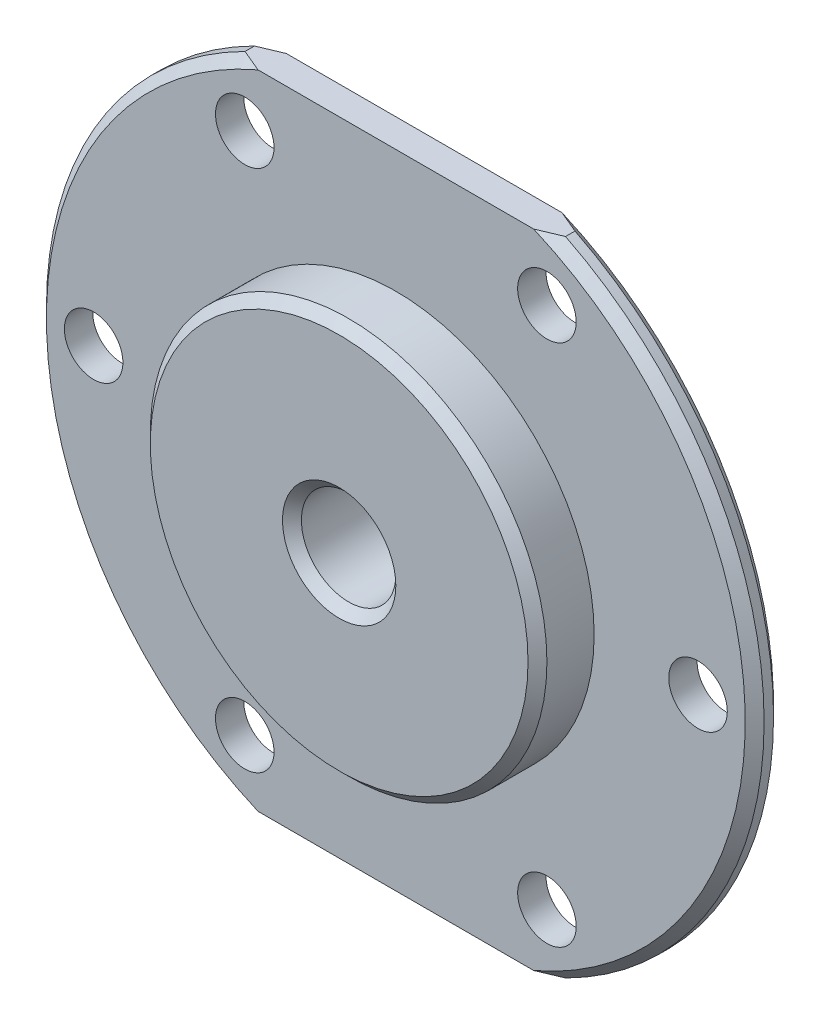
ISO-10303-21;
HEADER;
FILE_DESCRIPTION(('STEP AP214'),'2;1');
FILE_NAME('part.step','',(''),(''),'','','');
FILE_SCHEMA(('AUTOMOTIVE_DESIGN { 1 0 10303 214 1 1 1 1 }'));
ENDSEC;
DATA;
#1=APPLICATION_CONTEXT('core data for automotive mechanical design processes');
#2=APPLICATION_PROTOCOL_DEFINITION('international standard','automotive_design',2000,#1);
#3=PRODUCT_CONTEXT('',#1,'mechanical');
#4=PRODUCT('Part','Part','',(#3));
#5=PRODUCT_RELATED_PRODUCT_CATEGORY('part','',(#4));
#6=PRODUCT_DEFINITION_FORMATION('','',#4);
#7=PRODUCT_DEFINITION_CONTEXT('part definition',#1,'design');
#8=PRODUCT_DEFINITION('design','',#6,#7);
#9=PRODUCT_DEFINITION_SHAPE('','',#8);
#10=(LENGTH_UNIT() NAMED_UNIT(*) SI_UNIT(.MILLI.,.METRE.));
#11=(NAMED_UNIT(*) PLANE_ANGLE_UNIT() SI_UNIT($,.RADIAN.));
#12=(NAMED_UNIT(*) SI_UNIT($,.STERADIAN.) SOLID_ANGLE_UNIT());
#13=UNCERTAINTY_MEASURE_WITH_UNIT(LENGTH_MEASURE(1.E-05),#10,'distance_accuracy_value','');
#14=(GEOMETRIC_REPRESENTATION_CONTEXT(3) GLOBAL_UNCERTAINTY_ASSIGNED_CONTEXT((#13)) GLOBAL_UNIT_ASSIGNED_CONTEXT((#10,
#11,#12)) REPRESENTATION_CONTEXT('',''));
#15=CARTESIAN_POINT('',(0.,0.,0.));
#16=DIRECTION('',(0.,0.,1.));
#17=DIRECTION('',(1.,0.,0.));
#18=AXIS2_PLACEMENT_3D('',#15,#16,#17);
#19=CARTESIAN_POINT('',(0.,0.,1.5));
#20=DIRECTION('',(0.,0.,1.));
#21=DIRECTION('',(1.,0.,0.));
#22=AXIS2_PLACEMENT_3D('',#19,#20,#21);
#23=PLANE('',#22);
#24=CARTESIAN_POINT('',(0.,0.,1.5));
#25=DIRECTION('',(0.,0.,1.));
#26=DIRECTION('',(1.,0.,0.));
#27=AXIS2_PLACEMENT_3D('',#24,#25,#26);
#28=CIRCLE('',#27,10.5);
#29=CARTESIAN_POINT('',(10.5,0.,1.5));
#30=VERTEX_POINT('',#29);
#31=EDGE_CURVE('E349',#30,#30,#28,.T.);
#32=ORIENTED_EDGE('',*,*,#31,.F.);
#33=EDGE_LOOP('',(#32));
#34=FACE_BOUND('',#33,.T.);
#35=CARTESIAN_POINT('',(7.99999999999987,-13.8564064605511,1.5));
#36=DIRECTION('',(0.,0.,1.));
#37=DIRECTION('',(1.,0.,0.));
#38=AXIS2_PLACEMENT_3D('',#35,#36,#37);
#39=CIRCLE('',#38,1.55);
#40=CARTESIAN_POINT('',(9.54999999999987,-13.8564064605511,1.5));
#41=VERTEX_POINT('',#40);
#42=EDGE_CURVE('E359',#41,#41,#39,.T.);
#43=ORIENTED_EDGE('',*,*,#42,.F.);
#44=EDGE_LOOP('',(#43));
#45=FACE_BOUND('',#44,.T.);
#46=CARTESIAN_POINT('',(8.00000000000007,13.856406460551,1.5));
#47=DIRECTION('',(0.,0.,1.));
#48=DIRECTION('',(1.,0.,0.));
#49=AXIS2_PLACEMENT_3D('',#46,#47,#48);
#50=CIRCLE('',#49,1.55);
#51=CARTESIAN_POINT('',(9.55000000000006,13.856406460551,1.5));
#52=VERTEX_POINT('',#51);
#53=EDGE_CURVE('E371',#52,#52,#50,.T.);
#54=ORIENTED_EDGE('',*,*,#53,.F.);
#55=EDGE_LOOP('',(#54));
#56=FACE_BOUND('',#55,.T.);
#57=CARTESIAN_POINT('',(-16.,0.,1.5));
#58=DIRECTION('',(0.,0.,1.));
#59=DIRECTION('',(1.,0.,0.));
#60=AXIS2_PLACEMENT_3D('',#57,#58,#59);
#61=CIRCLE('',#60,1.55);
#62=CARTESIAN_POINT('',(-14.45,0.,1.5));
#63=VERTEX_POINT('',#62);
#64=EDGE_CURVE('E138',#63,#63,#61,.T.);
#65=ORIENTED_EDGE('',*,*,#64,.F.);
#66=EDGE_LOOP('',(#65));
#67=FACE_BOUND('',#66,.T.);
#68=DIRECTION('',(-1.,0.,0.));
#69=VECTOR('',#68,1.);
#70=CARTESIAN_POINT('',(-8.48528137423857,17.,1.5));
#71=LINE('',#70,#69);
#72=CARTESIAN_POINT('',(7.2972597596632,17.,1.5));
#73=VERTEX_POINT('',#72);
#74=CARTESIAN_POINT('',(-7.2972597596632,17.,1.5));
#75=VERTEX_POINT('',#74);
#76=EDGE_CURVE('E115',#73,#75,#71,.T.);
#77=ORIENTED_EDGE('',*,*,#76,.T.);
#78=CARTESIAN_POINT('',(0.,0.,1.5));
#79=DIRECTION('',(0.,0.,1.));
#80=DIRECTION('',(1.,0.,0.));
#81=AXIS2_PLACEMENT_3D('',#78,#79,#80);
#82=CIRCLE('',#81,18.5);
#83=CARTESIAN_POINT('',(-7.2972597596632,-17.,1.5));
#84=VERTEX_POINT('',#83);
#85=EDGE_CURVE('E119',#75,#84,#82,.T.);
#86=ORIENTED_EDGE('',*,*,#85,.T.);
#87=DIRECTION('',(1.,0.,0.));
#88=VECTOR('',#87,1.);
#89=CARTESIAN_POINT('',(-8.48528137423857,-17.,1.5));
#90=LINE('',#89,#88);
#91=CARTESIAN_POINT('',(7.2972597596632,-17.,1.5));
#92=VERTEX_POINT('',#91);
#93=EDGE_CURVE('E118',#84,#92,#90,.T.);
#94=ORIENTED_EDGE('',*,*,#93,.T.);
#95=CARTESIAN_POINT('',(0.,0.,1.5));
#96=DIRECTION('',(0.,0.,1.));
#97=DIRECTION('',(1.,0.,0.));
#98=AXIS2_PLACEMENT_3D('',#95,#96,#97);
#99=CIRCLE('',#98,18.5);
#100=EDGE_CURVE('E106',#92,#73,#99,.T.);
#101=ORIENTED_EDGE('',*,*,#100,.T.);
#102=EDGE_LOOP('',(#77,#86,#94,#101));
#103=FACE_BOUND('',#102,.T.);
#104=CARTESIAN_POINT('',(-7.99999999999997,13.856406460551,1.5));
#105=DIRECTION('',(0.,0.,1.));
#106=DIRECTION('',(1.,0.,0.));
#107=AXIS2_PLACEMENT_3D('',#104,#105,#106);
#108=CIRCLE('',#107,1.55);
#109=CARTESIAN_POINT('',(-6.44999999999997,13.856406460551,1.5));
#110=VERTEX_POINT('',#109);
#111=EDGE_CURVE('E377',#110,#110,#108,.T.);
#112=ORIENTED_EDGE('',*,*,#111,.F.);
#113=EDGE_LOOP('',(#112));
#114=FACE_BOUND('',#113,.T.);
#115=CARTESIAN_POINT('',(16.,-1.1172740284298E-13,1.5));
#116=DIRECTION('',(0.,0.,1.));
#117=DIRECTION('',(1.,0.,0.));
#118=AXIS2_PLACEMENT_3D('',#115,#116,#117);
#119=CIRCLE('',#118,1.55);
#120=CARTESIAN_POINT('',(17.55,-1.1172740284298E-13,1.5));
#121=VERTEX_POINT('',#120);
#122=EDGE_CURVE('E365',#121,#121,#119,.T.);
#123=ORIENTED_EDGE('',*,*,#122,.F.);
#124=EDGE_LOOP('',(#123));
#125=FACE_BOUND('',#124,.T.);
#126=CARTESIAN_POINT('',(-8.00000000000016,-13.8564064605509,1.5));
#127=DIRECTION('',(0.,0.,1.));
#128=DIRECTION('',(1.,0.,0.));
#129=AXIS2_PLACEMENT_3D('',#126,#127,#128);
#130=CIRCLE('',#129,1.55);
#131=CARTESIAN_POINT('',(-6.45000000000016,-13.8564064605509,1.5));
#132=VERTEX_POINT('',#131);
#133=EDGE_CURVE('E353',#132,#132,#130,.T.);
#134=ORIENTED_EDGE('',*,*,#133,.F.);
#135=EDGE_LOOP('',(#134));
#136=FACE_BOUND('',#135,.T.);
#137=ADVANCED_FACE('F35',(#34,#45,#56,#67,#103,#114,#125,#136),#23,.T.);
#138=CARTESIAN_POINT('',(0.,0.,0.));
#139=DIRECTION('',(0.,0.,1.));
#140=DIRECTION('',(1.,0.,0.));
#141=AXIS2_PLACEMENT_3D('',#138,#139,#140);
#142=PLANE('',#141);
#143=CARTESIAN_POINT('',(0.,0.,0.));
#144=DIRECTION('',(0.,0.,-1.));
#145=DIRECTION('',(-1.,0.,0.));
#146=AXIS2_PLACEMENT_3D('',#143,#144,#145);
#147=CIRCLE('',#146,5.);
#148=CARTESIAN_POINT('',(-5.,0.,0.));
#149=VERTEX_POINT('',#148);
#150=EDGE_CURVE('E150',#149,#149,#147,.T.);
#151=ORIENTED_EDGE('',*,*,#150,.F.);
#152=EDGE_LOOP('',(#151));
#153=FACE_BOUND('',#152,.T.);
#154=DIRECTION('',(1.,0.,0.));
#155=VECTOR('',#154,1.);
#156=CARTESIAN_POINT('',(-8.48528137423857,-17.,0.));
#157=LINE('',#156,#155);
#158=CARTESIAN_POINT('',(-7.29725975966319,-17.,0.));
#159=VERTEX_POINT('',#158);
#160=CARTESIAN_POINT('',(7.29725975966319,-17.,0.));
#161=VERTEX_POINT('',#160);
#162=EDGE_CURVE('E126',#159,#161,#157,.T.);
#163=ORIENTED_EDGE('',*,*,#162,.F.);
#164=CARTESIAN_POINT('',(0.,0.,0.));
#165=DIRECTION('',(0.,0.,1.));
#166=DIRECTION('',(1.,0.,0.));
#167=AXIS2_PLACEMENT_3D('',#164,#165,#166);
#168=CIRCLE('',#167,18.5);
#169=CARTESIAN_POINT('',(-7.29725975966319,17.,0.));
#170=VERTEX_POINT('',#169);
#171=EDGE_CURVE('E264',#159,#170,#168,.F.);
#172=ORIENTED_EDGE('',*,*,#171,.T.);
#173=DIRECTION('',(-1.,0.,0.));
#174=VECTOR('',#173,1.);
#175=CARTESIAN_POINT('',(-8.48528137423857,17.,0.));
#176=LINE('',#175,#174);
#177=CARTESIAN_POINT('',(7.29725975966319,17.,0.));
#178=VERTEX_POINT('',#177);
#179=EDGE_CURVE('E131',#178,#170,#176,.T.);
#180=ORIENTED_EDGE('',*,*,#179,.F.);
#181=CARTESIAN_POINT('',(0.,0.,0.));
#182=DIRECTION('',(0.,0.,1.));
#183=DIRECTION('',(1.,0.,0.));
#184=AXIS2_PLACEMENT_3D('',#181,#182,#183);
#185=CIRCLE('',#184,18.5);
#186=EDGE_CURVE('E263',#178,#161,#185,.F.);
#187=ORIENTED_EDGE('',*,*,#186,.T.);
#188=EDGE_LOOP('',(#163,#172,#180,#187));
#189=FACE_BOUND('',#188,.T.);
#190=CARTESIAN_POINT('',(-16.,0.,0.));
#191=DIRECTION('',(0.,0.,1.));
#192=DIRECTION('',(1.,0.,0.));
#193=AXIS2_PLACEMENT_3D('',#190,#191,#192);
#194=CIRCLE('',#193,1.55);
#195=CARTESIAN_POINT('',(-14.45,0.,0.));
#196=VERTEX_POINT('',#195);
#197=EDGE_CURVE('E134',#196,#196,#194,.T.);
#198=ORIENTED_EDGE('',*,*,#197,.T.);
#199=EDGE_LOOP('',(#198));
#200=FACE_BOUND('',#199,.T.);
#201=CARTESIAN_POINT('',(-7.99999999999997,13.856406460551,0.));
#202=DIRECTION('',(0.,0.,1.));
#203=DIRECTION('',(1.,0.,0.));
#204=AXIS2_PLACEMENT_3D('',#201,#202,#203);
#205=CIRCLE('',#204,1.55);
#206=CARTESIAN_POINT('',(-6.44999999999997,13.856406460551,0.));
#207=VERTEX_POINT('',#206);
#208=EDGE_CURVE('E374',#207,#207,#205,.T.);
#209=ORIENTED_EDGE('',*,*,#208,.T.);
#210=EDGE_LOOP('',(#209));
#211=FACE_BOUND('',#210,.T.);
#212=CARTESIAN_POINT('',(8.00000000000007,13.856406460551,0.));
#213=DIRECTION('',(0.,0.,1.));
#214=DIRECTION('',(1.,0.,0.));
#215=AXIS2_PLACEMENT_3D('',#212,#213,#214);
#216=CIRCLE('',#215,1.55);
#217=CARTESIAN_POINT('',(9.55000000000006,13.856406460551,0.));
#218=VERTEX_POINT('',#217);
#219=EDGE_CURVE('E368',#218,#218,#216,.T.);
#220=ORIENTED_EDGE('',*,*,#219,.T.);
#221=EDGE_LOOP('',(#220));
#222=FACE_BOUND('',#221,.T.);
#223=CARTESIAN_POINT('',(16.,-1.1172740284298E-13,0.));
#224=DIRECTION('',(0.,0.,1.));
#225=DIRECTION('',(1.,0.,0.));
#226=AXIS2_PLACEMENT_3D('',#223,#224,#225);
#227=CIRCLE('',#226,1.55);
#228=CARTESIAN_POINT('',(17.55,-1.1172740284298E-13,0.));
#229=VERTEX_POINT('',#228);
#230=EDGE_CURVE('E362',#229,#229,#227,.T.);
#231=ORIENTED_EDGE('',*,*,#230,.T.);
#232=EDGE_LOOP('',(#231));
#233=FACE_BOUND('',#232,.T.);
#234=CARTESIAN_POINT('',(7.99999999999987,-13.8564064605511,0.));
#235=DIRECTION('',(0.,0.,1.));
#236=DIRECTION('',(1.,0.,0.));
#237=AXIS2_PLACEMENT_3D('',#234,#235,#236);
#238=CIRCLE('',#237,1.55);
#239=CARTESIAN_POINT('',(9.54999999999987,-13.8564064605511,0.));
#240=VERTEX_POINT('',#239);
#241=EDGE_CURVE('E356',#240,#240,#238,.T.);
#242=ORIENTED_EDGE('',*,*,#241,.T.);
#243=EDGE_LOOP('',(#242));
#244=FACE_BOUND('',#243,.T.);
#245=CARTESIAN_POINT('',(-8.00000000000016,-13.8564064605509,0.));
#246=DIRECTION('',(0.,0.,1.));
#247=DIRECTION('',(1.,0.,0.));
#248=AXIS2_PLACEMENT_3D('',#245,#246,#247);
#249=CIRCLE('',#248,1.55);
#250=CARTESIAN_POINT('',(-6.45000000000016,-13.8564064605509,0.));
#251=VERTEX_POINT('',#250);
#252=EDGE_CURVE('E352',#251,#251,#249,.T.);
#253=ORIENTED_EDGE('',*,*,#252,.T.);
#254=EDGE_LOOP('',(#253));
#255=FACE_BOUND('',#254,.T.);
#256=ADVANCED_FACE('F191',(#153,#189,#200,#211,#222,#233,#244,#255),#142,.F.);
#257=CARTESIAN_POINT('',(0.,0.,1.5));
#258=DIRECTION('',(0.,0.,-1.));
#259=DIRECTION('',(-1.,0.,0.));
#260=AXIS2_PLACEMENT_3D('',#257,#258,#259);
#261=CYLINDRICAL_SURFACE('',#260,19.);
#262=DIRECTION('',(0.,0.,-1.));
#263=VECTOR('',#262,1.);
#264=CARTESIAN_POINT('',(8.48528137423857,-17.,1.5));
#265=LINE('',#264,#263);
#266=CARTESIAN_POINT('',(8.48528137423857,-17.,0.999999999999993));
#267=VERTEX_POINT('',#266);
#268=CARTESIAN_POINT('',(8.48528137423857,-17.,0.500000000000004));
#269=VERTEX_POINT('',#268);
#270=EDGE_CURVE('E128',#267,#269,#265,.T.);
#271=ORIENTED_EDGE('',*,*,#270,.T.);
#272=CARTESIAN_POINT('',(0.,0.,0.500000000000004));
#273=DIRECTION('',(0.,0.,1.));
#274=DIRECTION('',(1.,0.,0.));
#275=AXIS2_PLACEMENT_3D('',#272,#273,#274);
#276=CIRCLE('',#275,19.);
#277=CARTESIAN_POINT('',(8.48528137423857,17.,0.500000000000004));
#278=VERTEX_POINT('',#277);
#279=EDGE_CURVE('E271',#269,#278,#276,.T.);
#280=ORIENTED_EDGE('',*,*,#279,.T.);
#281=DIRECTION('',(0.,0.,-1.));
#282=VECTOR('',#281,1.);
#283=CARTESIAN_POINT('',(8.48528137423857,17.,1.5));
#284=LINE('',#283,#282);
#285=CARTESIAN_POINT('',(8.48528137423857,17.,0.999999999999993));
#286=VERTEX_POINT('',#285);
#287=EDGE_CURVE('E148',#286,#278,#284,.T.);
#288=ORIENTED_EDGE('',*,*,#287,.F.);
#289=CARTESIAN_POINT('',(0.,0.,0.999999999999993));
#290=DIRECTION('',(0.,0.,1.));
#291=DIRECTION('',(1.,0.,0.));
#292=AXIS2_PLACEMENT_3D('',#289,#290,#291);
#293=CIRCLE('',#292,19.);
#294=EDGE_CURVE('E107',#286,#267,#293,.F.);
#295=ORIENTED_EDGE('',*,*,#294,.T.);
#296=EDGE_LOOP('',(#271,#280,#288,#295));
#297=FACE_BOUND('',#296,.T.);
#298=ADVANCED_FACE('F246',(#297),#261,.T.);
#299=CARTESIAN_POINT('',(-8.48528137423857,17.,1.5));
#300=DIRECTION('',(0.,-1.,0.));
#301=DIRECTION('',(0.,0.,-1.));
#302=AXIS2_PLACEMENT_3D('',#299,#300,#301);
#303=PLANE('',#302);
#304=DIRECTION('',(0.,0.,-1.));
#305=VECTOR('',#304,1.);
#306=CARTESIAN_POINT('',(-8.48528137423857,17.,1.5));
#307=LINE('',#306,#305);
#308=CARTESIAN_POINT('',(-8.48528137423857,17.,0.999999999999993));
#309=VERTEX_POINT('',#308);
#310=CARTESIAN_POINT('',(-8.48528137423857,17.,0.500000000000004));
#311=VERTEX_POINT('',#310);
#312=EDGE_CURVE('E145',#309,#311,#307,.T.);
#313=ORIENTED_EDGE('',*,*,#312,.F.);
#314=CARTESIAN_POINT('',(-8.48528137423857,17.,0.999999999999993));
#315=CARTESIAN_POINT('',(-8.38719130902525,17.,1.04380624823699));
#316=CARTESIAN_POINT('',(-8.28887455002269,17.,1.08710595615498));
#317=CARTESIAN_POINT('',(-8.09179549900561,17.,1.17264561788025));
#318=CARTESIAN_POINT('',(-7.99303326311037,17.,1.21488570100536));
#319=CARTESIAN_POINT('',(-7.79504652511086,17.,1.2982704281212));
#320=CARTESIAN_POINT('',(-7.69582202053382,17.,1.33941506624422));
#321=CARTESIAN_POINT('',(-7.49689622621429,17.,1.42057032952312));
#322=CARTESIAN_POINT('',(-7.39719487948351,17.,1.46058081496524));
#323=CARTESIAN_POINT('',(-7.29725975966321,17.,1.50000000000003));
#324=B_SPLINE_CURVE_WITH_KNOTS('',3,(#314,#315,#316,#317,#318,#319,#320,#321,#322,#323),
.UNSPECIFIED.,.F.,.F.,(4,2,2,2,4),(0.,0.322281422409657,0.644523319969038,0.96676694325308,
1.2890500920069),.UNSPECIFIED.);
#325=EDGE_CURVE('E125',#309,#75,#324,.T.);
#326=ORIENTED_EDGE('',*,*,#325,.T.);
#327=ORIENTED_EDGE('',*,*,#76,.F.);
#328=CARTESIAN_POINT('',(7.2972597596632,17.,1.5));
#329=CARTESIAN_POINT('',(7.3971948794835,17.,1.46058081496522));
#330=CARTESIAN_POINT('',(7.49689622621428,17.,1.42057032952312));
#331=CARTESIAN_POINT('',(7.69582202053382,17.,1.33941506624423));
#332=CARTESIAN_POINT('',(7.79504652511086,17.,1.2982704281212));
#333=CARTESIAN_POINT('',(7.99303326311036,17.,1.21488570100536));
#334=CARTESIAN_POINT('',(8.0917954990056,17.,1.17264561788025));
#335=CARTESIAN_POINT('',(8.28887455002269,17.,1.08710595615498));
#336=CARTESIAN_POINT('',(8.38719130902525,17.,1.04380624823699));
#337=CARTESIAN_POINT('',(8.48528137423857,17.,1.));
#338=B_SPLINE_CURVE_WITH_KNOTS('',3,(#328,#329,#330,#331,#332,#333,#334,#335,#336,#337),
.UNSPECIFIED.,.F.,.F.,(4,2,2,2,4),(0.,0.322283148753816,0.644526772037856,0.966768669597236,
1.28905009200689),.UNSPECIFIED.);
#339=EDGE_CURVE('E59',#73,#286,#338,.T.);
#340=ORIENTED_EDGE('',*,*,#339,.T.);
#341=ORIENTED_EDGE('',*,*,#287,.T.);
#342=CARTESIAN_POINT('',(8.48528137423857,17.,0.500000000000004));
#343=CARTESIAN_POINT('',(8.38719130902525,17.,0.45619375176301));
#344=CARTESIAN_POINT('',(8.28887455002269,17.,0.41289404384502));
#345=CARTESIAN_POINT('',(8.09179549900561,17.,0.327354382119747));
#346=CARTESIAN_POINT('',(7.99303326311036,17.,0.285114298994636));
#347=CARTESIAN_POINT('',(7.79504652511085,17.,0.201729571878804));
#348=CARTESIAN_POINT('',(7.69582202053382,17.,0.160584933755777));
#349=CARTESIAN_POINT('',(7.49689622621428,17.,0.0794296704768797));
#350=CARTESIAN_POINT('',(7.3971948794835,17.,0.0394191850347676));
#351=CARTESIAN_POINT('',(7.2972597596632,17.,0.));
#352=B_SPLINE_CURVE_WITH_KNOTS('',3,(#342,#343,#344,#345,#346,#347,#348,#349,#350,#351),
.UNSPECIFIED.,.F.,.F.,(4,2,2,2,4),(0.,0.322281422409656,0.644523319969038,0.966766943253082,
1.2890500920069),.UNSPECIFIED.);
#353=EDGE_CURVE('E51',#278,#178,#352,.T.);
#354=ORIENTED_EDGE('',*,*,#353,.T.);
#355=ORIENTED_EDGE('',*,*,#179,.T.);
#356=CARTESIAN_POINT('',(-7.29725975966319,17.,0.));
#357=CARTESIAN_POINT('',(-7.3971948794835,17.,0.0394191850347744));
#358=CARTESIAN_POINT('',(-7.49689622621428,17.,0.0794296704768802));
#359=CARTESIAN_POINT('',(-7.69582202053382,17.,0.160584933755774));
#360=CARTESIAN_POINT('',(-7.79504652511086,17.,0.201729571878803));
#361=CARTESIAN_POINT('',(-7.99303326311036,17.,0.285114298994638));
#362=CARTESIAN_POINT('',(-8.09179549900561,17.,0.32735438211975));
#363=CARTESIAN_POINT('',(-8.28887455002269,17.,0.412894043845021));
#364=CARTESIAN_POINT('',(-8.38719130902525,17.,0.456193751763007));
#365=CARTESIAN_POINT('',(-8.48528137423857,17.,0.499999999999993));
#366=B_SPLINE_CURVE_WITH_KNOTS('',3,(#356,#357,#358,#359,#360,#361,#362,#363,#364,#365),
.UNSPECIFIED.,.F.,.F.,(4,2,2,2,4),(0.,0.322283148753818,0.644526772037862,0.966768669597247,
1.2890500920069),.UNSPECIFIED.);
#367=EDGE_CURVE('E227',#170,#311,#366,.T.);
#368=ORIENTED_EDGE('',*,*,#367,.T.);
#369=EDGE_LOOP('',(#313,#326,#327,#340,#341,#354,#355,#368));
#370=FACE_BOUND('',#369,.T.);
#371=ADVANCED_FACE('F123',(#370),#303,.F.);
#372=CARTESIAN_POINT('',(0.,0.,1.5));
#373=DIRECTION('',(0.,0.,-1.));
#374=DIRECTION('',(-1.,0.,0.));
#375=AXIS2_PLACEMENT_3D('',#372,#373,#374);
#376=CYLINDRICAL_SURFACE('',#375,19.);
#377=DIRECTION('',(0.,0.,-1.));
#378=VECTOR('',#377,1.);
#379=CARTESIAN_POINT('',(-8.48528137423857,-17.,1.5));
#380=LINE('',#379,#378);
#381=CARTESIAN_POINT('',(-8.48528137423857,-17.,0.999999999999993));
#382=VERTEX_POINT('',#381);
#383=CARTESIAN_POINT('',(-8.48528137423857,-17.,0.500000000000004));
#384=VERTEX_POINT('',#383);
#385=EDGE_CURVE('E142',#382,#384,#380,.T.);
#386=ORIENTED_EDGE('',*,*,#385,.F.);
#387=CARTESIAN_POINT('',(0.,0.,0.999999999999993));
#388=DIRECTION('',(0.,0.,1.));
#389=DIRECTION('',(1.,0.,0.));
#390=AXIS2_PLACEMENT_3D('',#387,#388,#389);
#391=CIRCLE('',#390,19.);
#392=EDGE_CURVE('E108',#382,#309,#391,.F.);
#393=ORIENTED_EDGE('',*,*,#392,.T.);
#394=ORIENTED_EDGE('',*,*,#312,.T.);
#395=CARTESIAN_POINT('',(0.,0.,0.500000000000004));
#396=DIRECTION('',(0.,0.,1.));
#397=DIRECTION('',(1.,0.,0.));
#398=AXIS2_PLACEMENT_3D('',#395,#396,#397);
#399=CIRCLE('',#398,19.);
#400=EDGE_CURVE('E256',#311,#384,#399,.T.);
#401=ORIENTED_EDGE('',*,*,#400,.T.);
#402=EDGE_LOOP('',(#386,#393,#394,#401));
#403=FACE_BOUND('',#402,.T.);
#404=ADVANCED_FACE('F189',(#403),#376,.T.);
#405=CARTESIAN_POINT('',(-8.48528137423857,-17.,1.5));
#406=DIRECTION('',(0.,1.,0.));
#407=DIRECTION('',(0.,0.,1.));
#408=AXIS2_PLACEMENT_3D('',#405,#406,#407);
#409=PLANE('',#408);
#410=ORIENTED_EDGE('',*,*,#93,.F.);
#411=CARTESIAN_POINT('',(-7.2972597596632,-17.,1.5));
#412=CARTESIAN_POINT('',(-7.3971948794835,-17.,1.46058081496522));
#413=CARTESIAN_POINT('',(-7.49689622621428,-17.,1.42057032952312));
#414=CARTESIAN_POINT('',(-7.69582202053382,-17.,1.33941506624423));
#415=CARTESIAN_POINT('',(-7.79504652511086,-17.,1.2982704281212));
#416=CARTESIAN_POINT('',(-7.99303326311036,-17.,1.21488570100536));
#417=CARTESIAN_POINT('',(-8.0917954990056,-17.,1.17264561788025));
#418=CARTESIAN_POINT('',(-8.28887455002269,-17.,1.08710595615498));
#419=CARTESIAN_POINT('',(-8.38719130902525,-17.,1.04380624823699));
#420=CARTESIAN_POINT('',(-8.48528137423857,-17.,1.));
#421=B_SPLINE_CURVE_WITH_KNOTS('',3,(#411,#412,#413,#414,#415,#416,#417,#418,#419,#420),
.UNSPECIFIED.,.F.,.F.,(4,2,2,2,4),(0.,0.322283148753816,0.644526772037856,0.966768669597236,
1.28905009200689),.UNSPECIFIED.);
#422=EDGE_CURVE('E204',#84,#382,#421,.T.);
#423=ORIENTED_EDGE('',*,*,#422,.T.);
#424=ORIENTED_EDGE('',*,*,#385,.T.);
#425=CARTESIAN_POINT('',(-8.48528137423857,-17.,0.500000000000004));
#426=CARTESIAN_POINT('',(-8.38719130902525,-17.,0.45619375176301));
#427=CARTESIAN_POINT('',(-8.28887455002269,-17.,0.41289404384502));
#428=CARTESIAN_POINT('',(-8.09179549900561,-17.,0.327354382119747));
#429=CARTESIAN_POINT('',(-7.99303326311036,-17.,0.285114298994636));
#430=CARTESIAN_POINT('',(-7.79504652511085,-17.,0.201729571878804));
#431=CARTESIAN_POINT('',(-7.69582202053382,-17.,0.160584933755777));
#432=CARTESIAN_POINT('',(-7.49689622621428,-17.,0.0794296704768797));
#433=CARTESIAN_POINT('',(-7.3971948794835,-17.,0.0394191850347676));
#434=CARTESIAN_POINT('',(-7.2972597596632,-17.,0.));
#435=B_SPLINE_CURVE_WITH_KNOTS('',3,(#425,#426,#427,#428,#429,#430,#431,#432,#433,#434),
.UNSPECIFIED.,.F.,.F.,(4,2,2,2,4),(0.,0.322281422409656,0.644523319969038,0.966766943253082,
1.2890500920069),.UNSPECIFIED.);
#436=EDGE_CURVE('E198',#384,#159,#435,.T.);
#437=ORIENTED_EDGE('',*,*,#436,.T.);
#438=ORIENTED_EDGE('',*,*,#162,.T.);
#439=CARTESIAN_POINT('',(7.29725975966319,-17.,0.));
#440=CARTESIAN_POINT('',(7.39719487948349,-17.,0.0394191850347752));
#441=CARTESIAN_POINT('',(7.49689622621428,-17.,0.0794296704768806));
#442=CARTESIAN_POINT('',(7.69582202053382,-17.,0.160584933755772));
#443=CARTESIAN_POINT('',(7.79504652511086,-17.,0.2017295718788));
#444=CARTESIAN_POINT('',(7.99303326311036,-17.,0.285114298994634));
#445=CARTESIAN_POINT('',(8.0917954990056,-17.,0.327354382119746));
#446=CARTESIAN_POINT('',(8.28887455002269,-17.,0.412894043845018));
#447=CARTESIAN_POINT('',(8.38719130902525,-17.,0.456193751763005));
#448=CARTESIAN_POINT('',(8.48528137423857,-17.,0.499999999999993));
#449=B_SPLINE_CURVE_WITH_KNOTS('',3,(#439,#440,#441,#442,#443,#444,#445,#446,#447,#448),
.UNSPECIFIED.,.F.,.F.,(4,2,2,2,4),(0.,0.322283148753819,0.644526772037861,0.966768669597243,
1.2890500920069),.UNSPECIFIED.);
#450=EDGE_CURVE('E174',#161,#269,#449,.T.);
#451=ORIENTED_EDGE('',*,*,#450,.T.);
#452=ORIENTED_EDGE('',*,*,#270,.F.);
#453=CARTESIAN_POINT('',(8.48528137423857,-17.,0.999999999999993));
#454=CARTESIAN_POINT('',(8.38719130902525,-17.,1.04380624823699));
#455=CARTESIAN_POINT('',(8.28887455002269,-17.,1.08710595615498));
#456=CARTESIAN_POINT('',(8.09179549900561,-17.,1.17264561788025));
#457=CARTESIAN_POINT('',(7.99303326311037,-17.,1.21488570100536));
#458=CARTESIAN_POINT('',(7.79504652511086,-17.,1.2982704281212));
#459=CARTESIAN_POINT('',(7.69582202053382,-17.,1.33941506624422));
#460=CARTESIAN_POINT('',(7.49689622621429,-17.,1.42057032952312));
#461=CARTESIAN_POINT('',(7.39719487948351,-17.,1.46058081496524));
#462=CARTESIAN_POINT('',(7.29725975966321,-17.,1.50000000000003));
#463=B_SPLINE_CURVE_WITH_KNOTS('',3,(#453,#454,#455,#456,#457,#458,#459,#460,#461,#462),
.UNSPECIFIED.,.F.,.F.,(4,2,2,2,4),(0.,0.322281422409655,0.644523319969037,0.966766943253078,
1.28905009200689),.UNSPECIFIED.);
#464=EDGE_CURVE('E166',#267,#92,#463,.T.);
#465=ORIENTED_EDGE('',*,*,#464,.T.);
#466=EDGE_LOOP('',(#410,#423,#424,#437,#438,#451,#452,#465));
#467=FACE_BOUND('',#466,.T.);
#468=ADVANCED_FACE('F183',(#467),#409,.F.);
#469=CARTESIAN_POINT('',(-16.,0.,1.5));
#470=DIRECTION('',(0.,0.,-1.));
#471=DIRECTION('',(-1.,0.,0.));
#472=AXIS2_PLACEMENT_3D('',#469,#470,#471);
#473=CYLINDRICAL_SURFACE('',#472,1.55);
#474=ORIENTED_EDGE('',*,*,#64,.T.);
#475=EDGE_LOOP('',(#474));
#476=FACE_BOUND('',#475,.T.);
#477=ORIENTED_EDGE('',*,*,#197,.F.);
#478=EDGE_LOOP('',(#477));
#479=FACE_BOUND('',#478,.T.);
#480=ADVANCED_FACE('F188',(#476,#479),#473,.F.);
#481=CARTESIAN_POINT('',(-7.99999999999997,13.856406460551,1.5));
#482=DIRECTION('',(0.,0.,-1.));
#483=DIRECTION('',(-1.,0.,0.));
#484=AXIS2_PLACEMENT_3D('',#481,#482,#483);
#485=CYLINDRICAL_SURFACE('',#484,1.55);
#486=ORIENTED_EDGE('',*,*,#111,.T.);
#487=EDGE_LOOP('',(#486));
#488=FACE_BOUND('',#487,.T.);
#489=ORIENTED_EDGE('',*,*,#208,.F.);
#490=EDGE_LOOP('',(#489));
#491=FACE_BOUND('',#490,.T.);
#492=ADVANCED_FACE('F312',(#488,#491),#485,.F.);
#493=CARTESIAN_POINT('',(8.00000000000007,13.856406460551,1.5));
#494=DIRECTION('',(0.,0.,-1.));
#495=DIRECTION('',(-1.,0.,0.));
#496=AXIS2_PLACEMENT_3D('',#493,#494,#495);
#497=CYLINDRICAL_SURFACE('',#496,1.55);
#498=ORIENTED_EDGE('',*,*,#53,.T.);
#499=EDGE_LOOP('',(#498));
#500=FACE_BOUND('',#499,.T.);
#501=ORIENTED_EDGE('',*,*,#219,.F.);
#502=EDGE_LOOP('',(#501));
#503=FACE_BOUND('',#502,.T.);
#504=ADVANCED_FACE('F316',(#500,#503),#497,.F.);
#505=CARTESIAN_POINT('',(16.,-1.1172740284298E-13,1.5));
#506=DIRECTION('',(0.,0.,-1.));
#507=DIRECTION('',(-1.,0.,0.));
#508=AXIS2_PLACEMENT_3D('',#505,#506,#507);
#509=CYLINDRICAL_SURFACE('',#508,1.55);
#510=ORIENTED_EDGE('',*,*,#122,.T.);
#511=EDGE_LOOP('',(#510));
#512=FACE_BOUND('',#511,.T.);
#513=ORIENTED_EDGE('',*,*,#230,.F.);
#514=EDGE_LOOP('',(#513));
#515=FACE_BOUND('',#514,.T.);
#516=ADVANCED_FACE('F320',(#512,#515),#509,.F.);
#517=CARTESIAN_POINT('',(7.99999999999987,-13.8564064605511,1.5));
#518=DIRECTION('',(0.,0.,-1.));
#519=DIRECTION('',(-1.,0.,0.));
#520=AXIS2_PLACEMENT_3D('',#517,#518,#519);
#521=CYLINDRICAL_SURFACE('',#520,1.55);
#522=ORIENTED_EDGE('',*,*,#42,.T.);
#523=EDGE_LOOP('',(#522));
#524=FACE_BOUND('',#523,.T.);
#525=ORIENTED_EDGE('',*,*,#241,.F.);
#526=EDGE_LOOP('',(#525));
#527=FACE_BOUND('',#526,.T.);
#528=ADVANCED_FACE('F324',(#524,#527),#521,.F.);
#529=CARTESIAN_POINT('',(-8.00000000000016,-13.8564064605509,1.5));
#530=DIRECTION('',(0.,0.,-1.));
#531=DIRECTION('',(-1.,0.,0.));
#532=AXIS2_PLACEMENT_3D('',#529,#530,#531);
#533=CYLINDRICAL_SURFACE('',#532,1.55);
#534=ORIENTED_EDGE('',*,*,#133,.T.);
#535=EDGE_LOOP('',(#534));
#536=FACE_BOUND('',#535,.T.);
#537=ORIENTED_EDGE('',*,*,#252,.F.);
#538=EDGE_LOOP('',(#537));
#539=FACE_BOUND('',#538,.T.);
#540=ADVANCED_FACE('F328',(#536,#539),#533,.F.);
#541=CARTESIAN_POINT('',(0.,0.,4.5));
#542=DIRECTION('',(0.,0.,-1.));
#543=DIRECTION('',(-1.,0.,0.));
#544=AXIS2_PLACEMENT_3D('',#541,#542,#543);
#545=CYLINDRICAL_SURFACE('',#544,10.5);
#546=CARTESIAN_POINT('',(0.,0.,4.));
#547=DIRECTION('',(0.,0.,1.));
#548=DIRECTION('',(1.,0.,0.));
#549=AXIS2_PLACEMENT_3D('',#546,#547,#548);
#550=CIRCLE('',#549,10.5);
#551=CARTESIAN_POINT('',(10.5,0.,4.));
#552=VERTEX_POINT('',#551);
#553=EDGE_CURVE('E11',#552,#552,#550,.F.);
#554=ORIENTED_EDGE('',*,*,#553,.T.);
#555=EDGE_LOOP('',(#554));
#556=FACE_BOUND('',#555,.T.);
#557=ORIENTED_EDGE('',*,*,#31,.T.);
#558=EDGE_LOOP('',(#557));
#559=FACE_BOUND('',#558,.T.);
#560=ADVANCED_FACE('F332',(#556,#559),#545,.T.);
#561=CARTESIAN_POINT('',(0.,0.,4.5));
#562=DIRECTION('',(0.,0.,1.));
#563=DIRECTION('',(1.,0.,0.));
#564=AXIS2_PLACEMENT_3D('',#561,#562,#563);
#565=PLANE('',#564);
#566=CARTESIAN_POINT('',(0.,0.,4.5));
#567=DIRECTION('',(0.,0.,1.));
#568=DIRECTION('',(1.,0.,0.));
#569=AXIS2_PLACEMENT_3D('',#566,#567,#568);
#570=CIRCLE('',#569,3.00000000000002);
#571=CARTESIAN_POINT('',(3.00000000000002,0.,4.5));
#572=VERTEX_POINT('',#571);
#573=EDGE_CURVE('E44',#572,#572,#570,.F.);
#574=ORIENTED_EDGE('',*,*,#573,.T.);
#575=EDGE_LOOP('',(#574));
#576=FACE_BOUND('',#575,.T.);
#577=CARTESIAN_POINT('',(0.,0.,4.5));
#578=DIRECTION('',(0.,0.,1.));
#579=DIRECTION('',(1.,0.,0.));
#580=AXIS2_PLACEMENT_3D('',#577,#578,#579);
#581=CIRCLE('',#580,9.99999999999999);
#582=CARTESIAN_POINT('',(9.99999999999999,0.,4.5));
#583=VERTEX_POINT('',#582);
#584=EDGE_CURVE('E273',#583,#583,#581,.T.);
#585=ORIENTED_EDGE('',*,*,#584,.T.);
#586=EDGE_LOOP('',(#585));
#587=FACE_BOUND('',#586,.T.);
#588=ADVANCED_FACE('F278',(#576,#587),#565,.T.);
#589=CARTESIAN_POINT('',(0.,0.,-5.));
#590=DIRECTION('',(0.,0.,1.));
#591=DIRECTION('',(1.,0.,0.));
#592=AXIS2_PLACEMENT_3D('',#589,#590,#591);
#593=CYLINDRICAL_SURFACE('',#592,5.);
#594=CARTESIAN_POINT('',(0.,0.,-4.5));
#595=DIRECTION('',(0.,0.,-1.));
#596=DIRECTION('',(-1.,0.,0.));
#597=AXIS2_PLACEMENT_3D('',#594,#595,#596);
#598=CIRCLE('',#597,5.);
#599=CARTESIAN_POINT('',(-5.,0.,-4.5));
#600=VERTEX_POINT('',#599);
#601=EDGE_CURVE('E157',#600,#600,#598,.F.);
#602=ORIENTED_EDGE('',*,*,#601,.T.);
#603=EDGE_LOOP('',(#602));
#604=FACE_BOUND('',#603,.T.);
#605=ORIENTED_EDGE('',*,*,#150,.T.);
#606=EDGE_LOOP('',(#605));
#607=FACE_BOUND('',#606,.T.);
#608=ADVANCED_FACE('F298',(#604,#607),#593,.T.);
#609=CARTESIAN_POINT('',(0.,0.,-5.));
#610=DIRECTION('',(0.,0.,-1.));
#611=DIRECTION('',(-1.,0.,0.));
#612=AXIS2_PLACEMENT_3D('',#609,#610,#611);
#613=PLANE('',#612);
#614=CARTESIAN_POINT('',(0.,0.,-5.));
#615=DIRECTION('',(0.,0.,-1.));
#616=DIRECTION('',(-1.,0.,0.));
#617=AXIS2_PLACEMENT_3D('',#614,#615,#616);
#618=CIRCLE('',#617,4.5);
#619=CARTESIAN_POINT('',(-4.5,0.,-5.));
#620=VERTEX_POINT('',#619);
#621=EDGE_CURVE('E154',#620,#620,#618,.T.);
#622=ORIENTED_EDGE('',*,*,#621,.T.);
#623=EDGE_LOOP('',(#622));
#624=FACE_BOUND('',#623,.T.);
#625=CARTESIAN_POINT('',(0.,0.,-5.));
#626=DIRECTION('',(0.,0.,-1.));
#627=DIRECTION('',(-1.,0.,0.));
#628=AXIS2_PLACEMENT_3D('',#625,#626,#627);
#629=CIRCLE('',#628,2.99999999999999);
#630=CARTESIAN_POINT('',(-2.99999999999999,0.,-5.));
#631=VERTEX_POINT('',#630);
#632=EDGE_CURVE('E151',#631,#631,#629,.F.);
#633=ORIENTED_EDGE('',*,*,#632,.T.);
#634=EDGE_LOOP('',(#633));
#635=FACE_BOUND('',#634,.T.);
#636=ADVANCED_FACE('F289',(#624,#635),#613,.T.);
#637=CARTESIAN_POINT('',(0.,0.,-5.));
#638=DIRECTION('',(0.,0.,1.));
#639=DIRECTION('',(1.,0.,0.));
#640=AXIS2_PLACEMENT_3D('',#637,#638,#639);
#641=CYLINDRICAL_SURFACE('',#640,2.5);
#642=CARTESIAN_POINT('',(0.,0.,-4.50000000000001));
#643=DIRECTION('',(0.,0.,-1.));
#644=DIRECTION('',(-1.,0.,0.));
#645=AXIS2_PLACEMENT_3D('',#642,#643,#644);
#646=CIRCLE('',#645,2.5);
#647=CARTESIAN_POINT('',(-2.5,0.,-4.50000000000001));
#648=VERTEX_POINT('',#647);
#649=EDGE_CURVE('E120',#648,#648,#646,.T.);
#650=ORIENTED_EDGE('',*,*,#649,.T.);
#651=EDGE_LOOP('',(#650));
#652=FACE_BOUND('',#651,.T.);
#653=CARTESIAN_POINT('',(0.,0.,3.99999999999999));
#654=DIRECTION('',(0.,0.,1.));
#655=DIRECTION('',(1.,0.,0.));
#656=AXIS2_PLACEMENT_3D('',#653,#654,#655);
#657=CIRCLE('',#656,2.5);
#658=CARTESIAN_POINT('',(2.5,0.,3.99999999999999));
#659=VERTEX_POINT('',#658);
#660=EDGE_CURVE('E160',#659,#659,#657,.T.);
#661=ORIENTED_EDGE('',*,*,#660,.T.);
#662=EDGE_LOOP('',(#661));
#663=FACE_BOUND('',#662,.T.);
#664=ADVANCED_FACE('F286',(#652,#663),#641,.F.);
#665=CARTESIAN_POINT('',(0.,0.,-5.));
#666=DIRECTION('',(0.,0.,1.));
#667=DIRECTION('',(1.,0.,0.));
#668=AXIS2_PLACEMENT_3D('',#665,#666,#667);
#669=CONICAL_SURFACE('',#668,4.5,0.785398163397445);
#670=ORIENTED_EDGE('',*,*,#601,.F.);
#671=EDGE_LOOP('',(#670));
#672=FACE_BOUND('',#671,.T.);
#673=ORIENTED_EDGE('',*,*,#621,.F.);
#674=EDGE_LOOP('',(#673));
#675=FACE_BOUND('',#674,.T.);
#676=ADVANCED_FACE('F288',(#672,#675),#669,.T.);
#677=CARTESIAN_POINT('',(0.,0.,-5.));
#678=DIRECTION('',(0.,0.,-1.));
#679=DIRECTION('',(-1.,0.,0.));
#680=AXIS2_PLACEMENT_3D('',#677,#678,#679);
#681=CONICAL_SURFACE('',#680,2.99999999999999,0.785398163397444);
#682=ORIENTED_EDGE('',*,*,#649,.F.);
#683=EDGE_LOOP('',(#682));
#684=FACE_BOUND('',#683,.T.);
#685=ORIENTED_EDGE('',*,*,#632,.F.);
#686=EDGE_LOOP('',(#685));
#687=FACE_BOUND('',#686,.T.);
#688=ADVANCED_FACE('F296',(#684,#687),#681,.F.);
#689=CARTESIAN_POINT('',(0.,0.,1.5));
#690=DIRECTION('',(0.,0.,-1.));
#691=DIRECTION('',(-1.,0.,0.));
#692=AXIS2_PLACEMENT_3D('',#689,#690,#691);
#693=CONICAL_SURFACE('',#692,18.5,0.785398163397445);
#694=ORIENTED_EDGE('',*,*,#325,.F.);
#695=ORIENTED_EDGE('',*,*,#392,.F.);
#696=ORIENTED_EDGE('',*,*,#422,.F.);
#697=ORIENTED_EDGE('',*,*,#85,.F.);
#698=EDGE_LOOP('',(#694,#695,#696,#697));
#699=FACE_BOUND('',#698,.T.);
#700=ADVANCED_FACE('F220',(#699),#693,.T.);
#701=CARTESIAN_POINT('',(0.,0.,0.500000000000004));
#702=DIRECTION('',(0.,0.,1.));
#703=DIRECTION('',(1.,0.,0.));
#704=AXIS2_PLACEMENT_3D('',#701,#702,#703);
#705=CONICAL_SURFACE('',#704,19.,0.785398163397452);
#706=ORIENTED_EDGE('',*,*,#367,.F.);
#707=ORIENTED_EDGE('',*,*,#171,.F.);
#708=ORIENTED_EDGE('',*,*,#436,.F.);
#709=ORIENTED_EDGE('',*,*,#400,.F.);
#710=EDGE_LOOP('',(#706,#707,#708,#709));
#711=FACE_BOUND('',#710,.T.);
#712=ADVANCED_FACE('F212',(#711),#705,.T.);
#713=CARTESIAN_POINT('',(0.,0.,0.500000000000004));
#714=DIRECTION('',(0.,0.,1.));
#715=DIRECTION('',(1.,0.,0.));
#716=AXIS2_PLACEMENT_3D('',#713,#714,#715);
#717=CONICAL_SURFACE('',#716,19.,0.785398163397452);
#718=ORIENTED_EDGE('',*,*,#450,.F.);
#719=ORIENTED_EDGE('',*,*,#186,.F.);
#720=ORIENTED_EDGE('',*,*,#353,.F.);
#721=ORIENTED_EDGE('',*,*,#279,.F.);
#722=EDGE_LOOP('',(#718,#719,#720,#721));
#723=FACE_BOUND('',#722,.T.);
#724=ADVANCED_FACE('F219',(#723),#717,.T.);
#725=CARTESIAN_POINT('',(0.,0.,1.5));
#726=DIRECTION('',(0.,0.,-1.));
#727=DIRECTION('',(-1.,0.,0.));
#728=AXIS2_PLACEMENT_3D('',#725,#726,#727);
#729=CONICAL_SURFACE('',#728,18.5,0.785398163397445);
#730=ORIENTED_EDGE('',*,*,#464,.F.);
#731=ORIENTED_EDGE('',*,*,#294,.F.);
#732=ORIENTED_EDGE('',*,*,#339,.F.);
#733=ORIENTED_EDGE('',*,*,#100,.F.);
#734=EDGE_LOOP('',(#730,#731,#732,#733));
#735=FACE_BOUND('',#734,.T.);
#736=ADVANCED_FACE('F105',(#735),#729,.T.);
#737=CARTESIAN_POINT('',(0.,0.,3.99999999999999));
#738=DIRECTION('',(0.,0.,1.));
#739=DIRECTION('',(1.,0.,0.));
#740=AXIS2_PLACEMENT_3D('',#737,#738,#739);
#741=CONICAL_SURFACE('',#740,2.5,0.785398163397454);
#742=ORIENTED_EDGE('',*,*,#573,.F.);
#743=EDGE_LOOP('',(#742));
#744=FACE_BOUND('',#743,.T.);
#745=ORIENTED_EDGE('',*,*,#660,.F.);
#746=EDGE_LOOP('',(#745));
#747=FACE_BOUND('',#746,.T.);
#748=ADVANCED_FACE('F281',(#744,#747),#741,.F.);
#749=CARTESIAN_POINT('',(0.,0.,4.5));
#750=DIRECTION('',(0.,0.,-1.));
#751=DIRECTION('',(-1.,0.,0.));
#752=AXIS2_PLACEMENT_3D('',#749,#750,#751);
#753=CONICAL_SURFACE('',#752,9.99999999999999,0.785398163397452);
#754=ORIENTED_EDGE('',*,*,#553,.F.);
#755=EDGE_LOOP('',(#754));
#756=FACE_BOUND('',#755,.T.);
#757=ORIENTED_EDGE('',*,*,#584,.F.);
#758=EDGE_LOOP('',(#757));
#759=FACE_BOUND('',#758,.T.);
#760=ADVANCED_FACE('F38',(#756,#759),#753,.T.);
#761=CLOSED_SHELL('',(#137,#256,#298,#371,#404,#468,#480,#492,#504,#516,#528,#540,#560,#588,
#608,#636,#664,#676,#688,#700,#712,#724,#736,#748,#760));
#762=MANIFOLD_SOLID_BREP('B2',#761);
#763=ADVANCED_BREP_SHAPE_REPRESENTATION('',(#18,#762),#14);
#764=SHAPE_DEFINITION_REPRESENTATION(#9,#763);
ENDSEC;
END-ISO-10303-21;
